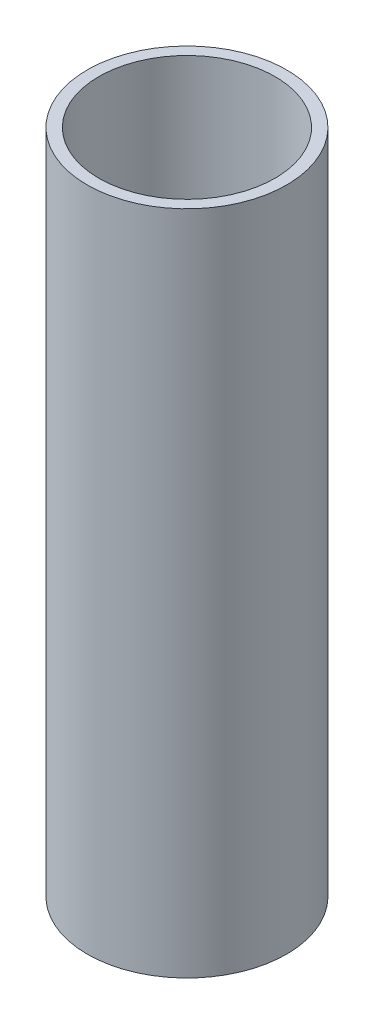
ISO-10303-21;
HEADER;
FILE_DESCRIPTION(('STEP AP214'),'2;1');
FILE_NAME('part.step','',(''),(''),'','','');
FILE_SCHEMA(('AUTOMOTIVE_DESIGN { 1 0 10303 214 1 1 1 1 }'));
ENDSEC;
DATA;
#1=APPLICATION_CONTEXT('core data for automotive mechanical design processes');
#2=APPLICATION_PROTOCOL_DEFINITION('international standard','automotive_design',2000,#1);
#3=PRODUCT_CONTEXT('',#1,'mechanical');
#4=PRODUCT('Part','Part','',(#3));
#5=PRODUCT_RELATED_PRODUCT_CATEGORY('part','',(#4));
#6=PRODUCT_DEFINITION_FORMATION('','',#4);
#7=PRODUCT_DEFINITION_CONTEXT('part definition',#1,'design');
#8=PRODUCT_DEFINITION('design','',#6,#7);
#9=PRODUCT_DEFINITION_SHAPE('','',#8);
#10=(LENGTH_UNIT() NAMED_UNIT(*) SI_UNIT(.MILLI.,.METRE.));
#11=(NAMED_UNIT(*) PLANE_ANGLE_UNIT() SI_UNIT($,.RADIAN.));
#12=(NAMED_UNIT(*) SI_UNIT($,.STERADIAN.) SOLID_ANGLE_UNIT());
#13=UNCERTAINTY_MEASURE_WITH_UNIT(LENGTH_MEASURE(1.E-05),#10,'distance_accuracy_value','');
#14=(GEOMETRIC_REPRESENTATION_CONTEXT(3) GLOBAL_UNCERTAINTY_ASSIGNED_CONTEXT((#13)) GLOBAL_UNIT_ASSIGNED_CONTEXT((#10,
#11,#12)) REPRESENTATION_CONTEXT('',''));
#15=CARTESIAN_POINT('',(0.,0.,0.));
#16=DIRECTION('',(0.,0.,1.));
#17=DIRECTION('',(1.,0.,0.));
#18=AXIS2_PLACEMENT_3D('',#15,#16,#17);
#19=CARTESIAN_POINT('',(0.,10.033,0.));
#20=DIRECTION('',(0.,-1.,0.));
#21=DIRECTION('',(0.,0.,-1.));
#22=AXIS2_PLACEMENT_3D('',#19,#20,#21);
#23=CYLINDRICAL_SURFACE('',#22,3.00355);
#24=CARTESIAN_POINT('',(0.,10.033,0.));
#25=DIRECTION('',(0.,1.,0.));
#26=DIRECTION('',(0.,0.,1.));
#27=AXIS2_PLACEMENT_3D('',#24,#25,#26);
#28=CIRCLE('',#27,3.00355);
#29=CARTESIAN_POINT('',(0.,10.033,3.00355));
#30=VERTEX_POINT('',#29);
#31=EDGE_CURVE('E10',#30,#30,#28,.T.);
#32=ORIENTED_EDGE('',*,*,#31,.F.);
#33=EDGE_LOOP('',(#32));
#34=FACE_BOUND('',#33,.T.);
#35=CARTESIAN_POINT('',(0.,-10.033,0.));
#36=DIRECTION('',(0.,1.,0.));
#37=DIRECTION('',(0.,0.,1.));
#38=AXIS2_PLACEMENT_3D('',#35,#36,#37);
#39=CIRCLE('',#38,3.00355);
#40=CARTESIAN_POINT('',(0.,-10.033,3.00355));
#41=VERTEX_POINT('',#40);
#42=EDGE_CURVE('E41',#41,#41,#39,.T.);
#43=ORIENTED_EDGE('',*,*,#42,.T.);
#44=EDGE_LOOP('',(#43));
#45=FACE_BOUND('',#44,.T.);
#46=ADVANCED_FACE('F38',(#34,#45),#23,.T.);
#47=CARTESIAN_POINT('',(0.,10.033,0.));
#48=DIRECTION('',(0.,1.,0.));
#49=DIRECTION('',(0.,0.,1.));
#50=AXIS2_PLACEMENT_3D('',#47,#48,#49);
#51=PLANE('',#50);
#52=CARTESIAN_POINT('',(0.,10.033,0.));
#53=DIRECTION('',(0.,1.,0.));
#54=DIRECTION('',(0.,0.,1.));
#55=AXIS2_PLACEMENT_3D('',#52,#53,#54);
#56=CIRCLE('',#55,2.6543);
#57=CARTESIAN_POINT('',(0.,10.033,2.6543));
#58=VERTEX_POINT('',#57);
#59=EDGE_CURVE('E55',#58,#58,#56,.T.);
#60=ORIENTED_EDGE('',*,*,#59,.F.);
#61=EDGE_LOOP('',(#60));
#62=FACE_BOUND('',#61,.T.);
#63=ORIENTED_EDGE('',*,*,#31,.T.);
#64=EDGE_LOOP('',(#63));
#65=FACE_BOUND('',#64,.T.);
#66=ADVANCED_FACE('F62',(#62,#65),#51,.T.);
#67=CARTESIAN_POINT('',(0.,-10.033,0.));
#68=DIRECTION('',(0.,1.,0.));
#69=DIRECTION('',(0.,0.,1.));
#70=AXIS2_PLACEMENT_3D('',#67,#68,#69);
#71=PLANE('',#70);
#72=CARTESIAN_POINT('',(0.,-10.033,0.));
#73=DIRECTION('',(0.,1.,0.));
#74=DIRECTION('',(0.,0.,1.));
#75=AXIS2_PLACEMENT_3D('',#72,#73,#74);
#76=CIRCLE('',#75,2.65429999999999);
#77=CARTESIAN_POINT('',(0.,-10.033,2.65429999999999));
#78=VERTEX_POINT('',#77);
#79=EDGE_CURVE('E50',#78,#78,#76,.T.);
#80=ORIENTED_EDGE('',*,*,#79,.T.);
#81=EDGE_LOOP('',(#80));
#82=FACE_BOUND('',#81,.T.);
#83=ORIENTED_EDGE('',*,*,#42,.F.);
#84=EDGE_LOOP('',(#83));
#85=FACE_BOUND('',#84,.T.);
#86=ADVANCED_FACE('F64',(#82,#85),#71,.F.);
#87=CARTESIAN_POINT('',(0.,10.033,0.));
#88=DIRECTION('',(0.,1.,0.));
#89=DIRECTION('',(0.,0.,1.));
#90=AXIS2_PLACEMENT_3D('',#87,#88,#89);
#91=CYLINDRICAL_SURFACE('',#90,2.6543);
#92=ORIENTED_EDGE('',*,*,#79,.F.);
#93=EDGE_LOOP('',(#92));
#94=FACE_BOUND('',#93,.T.);
#95=ORIENTED_EDGE('',*,*,#59,.T.);
#96=EDGE_LOOP('',(#95));
#97=FACE_BOUND('',#96,.T.);
#98=ADVANCED_FACE('F60',(#94,#97),#91,.F.);
#99=CLOSED_SHELL('',(#46,#66,#86,#98));
#100=MANIFOLD_SOLID_BREP('B2',#99);
#101=ADVANCED_BREP_SHAPE_REPRESENTATION('',(#18,#100),#14);
#102=SHAPE_DEFINITION_REPRESENTATION(#9,#101);
ENDSEC;
END-ISO-10303-21;
